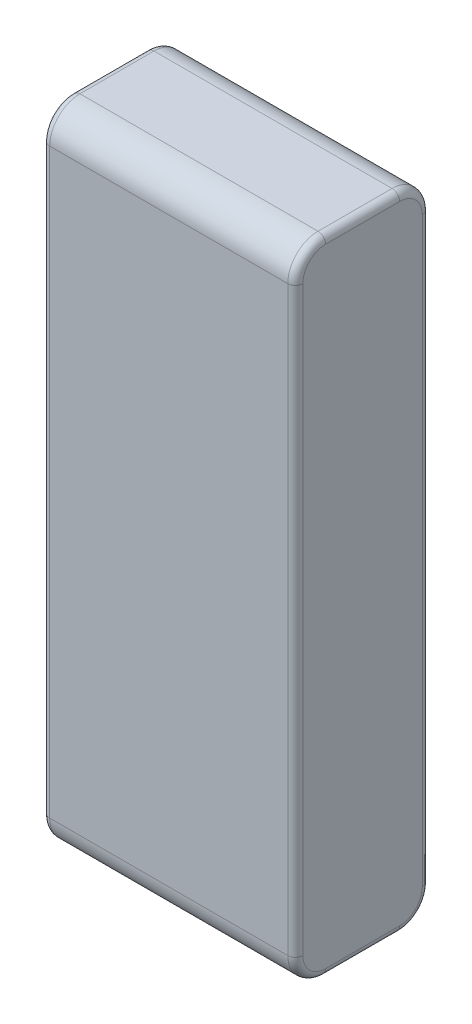
ISO-10303-21;
HEADER;
FILE_DESCRIPTION(('STEP AP214'),'2;1');
FILE_NAME('part.step','',(''),(''),'','','');
FILE_SCHEMA(('AUTOMOTIVE_DESIGN { 1 0 10303 214 1 1 1 1 }'));
ENDSEC;
DATA;
#1=APPLICATION_CONTEXT('core data for automotive mechanical design processes');
#2=APPLICATION_PROTOCOL_DEFINITION('international standard','automotive_design',2000,#1);
#3=PRODUCT_CONTEXT('',#1,'mechanical');
#4=PRODUCT('Part','Part','',(#3));
#5=PRODUCT_RELATED_PRODUCT_CATEGORY('part','',(#4));
#6=PRODUCT_DEFINITION_FORMATION('','',#4);
#7=PRODUCT_DEFINITION_CONTEXT('part definition',#1,'design');
#8=PRODUCT_DEFINITION('design','',#6,#7);
#9=PRODUCT_DEFINITION_SHAPE('','',#8);
#10=(LENGTH_UNIT() NAMED_UNIT(*) SI_UNIT(.MILLI.,.METRE.));
#11=(NAMED_UNIT(*) PLANE_ANGLE_UNIT() SI_UNIT($,.RADIAN.));
#12=(NAMED_UNIT(*) SI_UNIT($,.STERADIAN.) SOLID_ANGLE_UNIT());
#13=UNCERTAINTY_MEASURE_WITH_UNIT(LENGTH_MEASURE(1.E-05),#10,'distance_accuracy_value','');
#14=(GEOMETRIC_REPRESENTATION_CONTEXT(3) GLOBAL_UNCERTAINTY_ASSIGNED_CONTEXT((#13)) GLOBAL_UNIT_ASSIGNED_CONTEXT((#10,
#11,#12)) REPRESENTATION_CONTEXT('',''));
#15=CARTESIAN_POINT('',(0.,0.,0.));
#16=DIRECTION('',(0.,0.,1.));
#17=DIRECTION('',(1.,0.,0.));
#18=AXIS2_PLACEMENT_3D('',#15,#16,#17);
#19=CARTESIAN_POINT('',(16.75,-42.5,8.9));
#20=DIRECTION('',(-1.,0.,0.));
#21=DIRECTION('',(0.,0.,1.));
#22=AXIS2_PLACEMENT_3D('',#19,#20,#21);
#23=PLANE('',#22);
#24=DIRECTION('',(0.,1.,0.));
#25=VECTOR('',#24,1.);
#26=CARTESIAN_POINT('',(16.75,-42.5,7.9));
#27=LINE('',#26,#25);
#28=CARTESIAN_POINT('',(16.75,38.5,7.9));
#29=VERTEX_POINT('',#28);
#30=CARTESIAN_POINT('',(16.75,-38.5,7.9));
#31=VERTEX_POINT('',#30);
#32=EDGE_CURVE('E58',#29,#31,#27,.F.);
#33=ORIENTED_EDGE('',*,*,#32,.T.);
#34=CARTESIAN_POINT('',(16.75,-38.5,4.9));
#35=DIRECTION('',(-1.,0.,0.));
#36=DIRECTION('',(0.,0.,1.));
#37=AXIS2_PLACEMENT_3D('',#34,#35,#36);
#38=CIRCLE('',#37,3.);
#39=CARTESIAN_POINT('',(16.75,-41.5,4.9));
#40=VERTEX_POINT('',#39);
#41=EDGE_CURVE('E275',#31,#40,#38,.F.);
#42=ORIENTED_EDGE('',*,*,#41,.T.);
#43=DIRECTION('',(0.,0.,-1.));
#44=VECTOR('',#43,1.);
#45=CARTESIAN_POINT('',(16.75,-41.5,8.9));
#46=LINE('',#45,#44);
#47=CARTESIAN_POINT('',(16.75,-41.5,-4.9));
#48=VERTEX_POINT('',#47);
#49=EDGE_CURVE('E260',#40,#48,#46,.T.);
#50=ORIENTED_EDGE('',*,*,#49,.T.);
#51=CARTESIAN_POINT('',(16.75,-38.5,-4.9));
#52=DIRECTION('',(-1.,0.,0.));
#53=DIRECTION('',(0.,0.,1.));
#54=AXIS2_PLACEMENT_3D('',#51,#52,#53);
#55=CIRCLE('',#54,3.);
#56=CARTESIAN_POINT('',(16.75,-38.5,-7.9));
#57=VERTEX_POINT('',#56);
#58=EDGE_CURVE('E262',#48,#57,#55,.F.);
#59=ORIENTED_EDGE('',*,*,#58,.T.);
#60=DIRECTION('',(0.,1.,0.));
#61=VECTOR('',#60,1.);
#62=CARTESIAN_POINT('',(16.75,38.5,-7.9));
#63=LINE('',#62,#61);
#64=CARTESIAN_POINT('',(16.75,38.5,-7.9));
#65=VERTEX_POINT('',#64);
#66=EDGE_CURVE('E265',#57,#65,#63,.T.);
#67=ORIENTED_EDGE('',*,*,#66,.T.);
#68=CARTESIAN_POINT('',(16.75,38.5,-4.9));
#69=DIRECTION('',(-1.,0.,0.));
#70=DIRECTION('',(0.,0.,1.));
#71=AXIS2_PLACEMENT_3D('',#68,#69,#70);
#72=CIRCLE('',#71,3.);
#73=CARTESIAN_POINT('',(16.75,41.5,-4.9));
#74=VERTEX_POINT('',#73);
#75=EDGE_CURVE('E268',#65,#74,#72,.F.);
#76=ORIENTED_EDGE('',*,*,#75,.T.);
#77=DIRECTION('',(0.,0.,-1.));
#78=VECTOR('',#77,1.);
#79=CARTESIAN_POINT('',(16.75,41.5,8.9));
#80=LINE('',#79,#78);
#81=CARTESIAN_POINT('',(16.75,41.5,4.9));
#82=VERTEX_POINT('',#81);
#83=EDGE_CURVE('E270',#74,#82,#80,.F.);
#84=ORIENTED_EDGE('',*,*,#83,.T.);
#85=CARTESIAN_POINT('',(16.75,38.5,4.9));
#86=DIRECTION('',(-1.,0.,0.));
#87=DIRECTION('',(0.,0.,1.));
#88=AXIS2_PLACEMENT_3D('',#85,#86,#87);
#89=CIRCLE('',#88,3.);
#90=EDGE_CURVE('E63',#82,#29,#89,.F.);
#91=ORIENTED_EDGE('',*,*,#90,.T.);
#92=EDGE_LOOP('',(#33,#42,#50,#59,#67,#76,#84,#91));
#93=FACE_BOUND('',#92,.T.);
#94=ADVANCED_FACE('F40',(#93),#23,.F.);
#95=CARTESIAN_POINT('',(-16.75,42.5,8.9));
#96=DIRECTION('',(0.,-1.,0.));
#97=DIRECTION('',(0.,0.,-1.));
#98=AXIS2_PLACEMENT_3D('',#95,#96,#97);
#99=PLANE('',#98);
#100=DIRECTION('',(-1.,0.,0.));
#101=VECTOR('',#100,1.);
#102=CARTESIAN_POINT('',(-16.75,42.5,-4.9));
#103=LINE('',#102,#101);
#104=CARTESIAN_POINT('',(15.75,42.5,-4.9));
#105=VERTEX_POINT('',#104);
#106=CARTESIAN_POINT('',(-15.75,42.5,-4.9));
#107=VERTEX_POINT('',#106);
#108=EDGE_CURVE('E196',#105,#107,#103,.T.);
#109=ORIENTED_EDGE('',*,*,#108,.T.);
#110=DIRECTION('',(0.,0.,-1.));
#111=VECTOR('',#110,1.);
#112=CARTESIAN_POINT('',(-15.75,42.5,8.9));
#113=LINE('',#112,#111);
#114=CARTESIAN_POINT('',(-15.75,42.5,4.9));
#115=VERTEX_POINT('',#114);
#116=EDGE_CURVE('E231',#107,#115,#113,.F.);
#117=ORIENTED_EDGE('',*,*,#116,.T.);
#118=DIRECTION('',(-1.,0.,0.));
#119=VECTOR('',#118,1.);
#120=CARTESIAN_POINT('',(-16.75,42.5,4.9));
#121=LINE('',#120,#119);
#122=CARTESIAN_POINT('',(15.75,42.5,4.9));
#123=VERTEX_POINT('',#122);
#124=EDGE_CURVE('E202',#115,#123,#121,.F.);
#125=ORIENTED_EDGE('',*,*,#124,.T.);
#126=DIRECTION('',(0.,0.,-1.));
#127=VECTOR('',#126,1.);
#128=CARTESIAN_POINT('',(15.75,42.5,8.9));
#129=LINE('',#128,#127);
#130=EDGE_CURVE('E229',#123,#105,#129,.T.);
#131=ORIENTED_EDGE('',*,*,#130,.T.);
#132=EDGE_LOOP('',(#109,#117,#125,#131));
#133=FACE_BOUND('',#132,.T.);
#134=ADVANCED_FACE('F366',(#133),#99,.F.);
#135=CARTESIAN_POINT('',(-16.75,-42.5,8.9));
#136=DIRECTION('',(1.,0.,0.));
#137=DIRECTION('',(0.,0.,-1.));
#138=AXIS2_PLACEMENT_3D('',#135,#136,#137);
#139=PLANE('',#138);
#140=DIRECTION('',(0.,-1.,0.));
#141=VECTOR('',#140,1.);
#142=CARTESIAN_POINT('',(-16.75,-42.5,7.9));
#143=LINE('',#142,#141);
#144=CARTESIAN_POINT('',(-16.75,-38.5,7.9));
#145=VERTEX_POINT('',#144);
#146=CARTESIAN_POINT('',(-16.75,38.5,7.9));
#147=VERTEX_POINT('',#146);
#148=EDGE_CURVE('E172',#145,#147,#143,.F.);
#149=ORIENTED_EDGE('',*,*,#148,.T.);
#150=CARTESIAN_POINT('',(-16.75,38.5,4.9));
#151=DIRECTION('',(1.,0.,0.));
#152=DIRECTION('',(0.,0.,-1.));
#153=AXIS2_PLACEMENT_3D('',#150,#151,#152);
#154=CIRCLE('',#153,3.);
#155=CARTESIAN_POINT('',(-16.75,41.5,4.9));
#156=VERTEX_POINT('',#155);
#157=EDGE_CURVE('E219',#147,#156,#154,.F.);
#158=ORIENTED_EDGE('',*,*,#157,.T.);
#159=DIRECTION('',(0.,0.,-1.));
#160=VECTOR('',#159,1.);
#161=CARTESIAN_POINT('',(-16.75,41.5,8.9));
#162=LINE('',#161,#160);
#163=CARTESIAN_POINT('',(-16.75,41.5,-4.9));
#164=VERTEX_POINT('',#163);
#165=EDGE_CURVE('E216',#156,#164,#162,.T.);
#166=ORIENTED_EDGE('',*,*,#165,.T.);
#167=CARTESIAN_POINT('',(-16.75,38.5,-4.9));
#168=DIRECTION('',(1.,0.,0.));
#169=DIRECTION('',(0.,0.,-1.));
#170=AXIS2_PLACEMENT_3D('',#167,#168,#169);
#171=CIRCLE('',#170,3.);
#172=CARTESIAN_POINT('',(-16.75,38.5,-7.9));
#173=VERTEX_POINT('',#172);
#174=EDGE_CURVE('E214',#164,#173,#171,.F.);
#175=ORIENTED_EDGE('',*,*,#174,.T.);
#176=DIRECTION('',(0.,-1.,0.));
#177=VECTOR('',#176,1.);
#178=CARTESIAN_POINT('',(-16.75,-38.5,-7.9));
#179=LINE('',#178,#177);
#180=CARTESIAN_POINT('',(-16.75,-38.5,-7.9));
#181=VERTEX_POINT('',#180);
#182=EDGE_CURVE('E211',#173,#181,#179,.T.);
#183=ORIENTED_EDGE('',*,*,#182,.T.);
#184=CARTESIAN_POINT('',(-16.75,-38.5,-4.9));
#185=DIRECTION('',(1.,0.,0.));
#186=DIRECTION('',(0.,0.,-1.));
#187=AXIS2_PLACEMENT_3D('',#184,#185,#186);
#188=CIRCLE('',#187,3.);
#189=CARTESIAN_POINT('',(-16.75,-41.5,-4.9));
#190=VERTEX_POINT('',#189);
#191=EDGE_CURVE('E208',#181,#190,#188,.F.);
#192=ORIENTED_EDGE('',*,*,#191,.T.);
#193=DIRECTION('',(0.,0.,-1.));
#194=VECTOR('',#193,1.);
#195=CARTESIAN_POINT('',(-16.75,-41.5,8.9));
#196=LINE('',#195,#194);
#197=CARTESIAN_POINT('',(-16.75,-41.5,4.9));
#198=VERTEX_POINT('',#197);
#199=EDGE_CURVE('E175',#190,#198,#196,.F.);
#200=ORIENTED_EDGE('',*,*,#199,.T.);
#201=CARTESIAN_POINT('',(-16.75,-38.5,4.9));
#202=DIRECTION('',(1.,0.,0.));
#203=DIRECTION('',(0.,0.,-1.));
#204=AXIS2_PLACEMENT_3D('',#201,#202,#203);
#205=CIRCLE('',#204,3.);
#206=EDGE_CURVE('E167',#198,#145,#205,.F.);
#207=ORIENTED_EDGE('',*,*,#206,.T.);
#208=EDGE_LOOP('',(#149,#158,#166,#175,#183,#192,#200,#207));
#209=FACE_BOUND('',#208,.T.);
#210=ADVANCED_FACE('F169',(#209),#139,.F.);
#211=CARTESIAN_POINT('',(-16.75,-42.5,8.9));
#212=DIRECTION('',(0.,1.,0.));
#213=DIRECTION('',(0.,0.,1.));
#214=AXIS2_PLACEMENT_3D('',#211,#212,#213);
#215=PLANE('',#214);
#216=DIRECTION('',(1.,0.,0.));
#217=VECTOR('',#216,1.);
#218=CARTESIAN_POINT('',(-16.75,-42.5,4.9));
#219=LINE('',#218,#217);
#220=CARTESIAN_POINT('',(15.75,-42.5,4.9));
#221=VERTEX_POINT('',#220);
#222=CARTESIAN_POINT('',(-15.75,-42.5,4.9));
#223=VERTEX_POINT('',#222);
#224=EDGE_CURVE('E298',#221,#223,#219,.F.);
#225=ORIENTED_EDGE('',*,*,#224,.T.);
#226=DIRECTION('',(0.,0.,-1.));
#227=VECTOR('',#226,1.);
#228=CARTESIAN_POINT('',(-15.75,-42.5,8.9));
#229=LINE('',#228,#227);
#230=CARTESIAN_POINT('',(-15.75,-42.5,-4.9));
#231=VERTEX_POINT('',#230);
#232=EDGE_CURVE('E252',#223,#231,#229,.T.);
#233=ORIENTED_EDGE('',*,*,#232,.T.);
#234=DIRECTION('',(1.,0.,0.));
#235=VECTOR('',#234,1.);
#236=CARTESIAN_POINT('',(16.75,-42.5,-4.9));
#237=LINE('',#236,#235);
#238=CARTESIAN_POINT('',(15.75,-42.5,-4.9));
#239=VERTEX_POINT('',#238);
#240=EDGE_CURVE('E346',#231,#239,#237,.T.);
#241=ORIENTED_EDGE('',*,*,#240,.T.);
#242=DIRECTION('',(0.,0.,-1.));
#243=VECTOR('',#242,1.);
#244=CARTESIAN_POINT('',(15.75,-42.5,8.9));
#245=LINE('',#244,#243);
#246=EDGE_CURVE('E250',#239,#221,#245,.F.);
#247=ORIENTED_EDGE('',*,*,#246,.T.);
#248=EDGE_LOOP('',(#225,#233,#241,#247));
#249=FACE_BOUND('',#248,.T.);
#250=ADVANCED_FACE('F399',(#249),#215,.F.);
#251=CARTESIAN_POINT('',(0.,0.,8.9));
#252=DIRECTION('',(0.,0.,-1.));
#253=DIRECTION('',(-1.,0.,0.));
#254=AXIS2_PLACEMENT_3D('',#251,#252,#253);
#255=PLANE('',#254);
#256=DIRECTION('',(1.,0.,0.));
#257=VECTOR('',#256,1.);
#258=CARTESIAN_POINT('',(0.,-38.5,8.9));
#259=LINE('',#258,#257);
#260=CARTESIAN_POINT('',(-15.75,-38.5,8.9));
#261=VERTEX_POINT('',#260);
#262=CARTESIAN_POINT('',(15.75,-38.5,8.9));
#263=VERTEX_POINT('',#262);
#264=EDGE_CURVE('E359',#261,#263,#259,.T.);
#265=ORIENTED_EDGE('',*,*,#264,.T.);
#266=DIRECTION('',(0.,1.,0.));
#267=VECTOR('',#266,1.);
#268=CARTESIAN_POINT('',(15.75,0.,8.9));
#269=LINE('',#268,#267);
#270=CARTESIAN_POINT('',(15.75,38.5,8.9));
#271=VERTEX_POINT('',#270);
#272=EDGE_CURVE('E11',#263,#271,#269,.T.);
#273=ORIENTED_EDGE('',*,*,#272,.T.);
#274=DIRECTION('',(-1.,0.,0.));
#275=VECTOR('',#274,1.);
#276=CARTESIAN_POINT('',(0.,38.5,8.9));
#277=LINE('',#276,#275);
#278=CARTESIAN_POINT('',(-15.75,38.5,8.9));
#279=VERTEX_POINT('',#278);
#280=EDGE_CURVE('E349',#271,#279,#277,.T.);
#281=ORIENTED_EDGE('',*,*,#280,.T.);
#282=DIRECTION('',(0.,-1.,0.));
#283=VECTOR('',#282,1.);
#284=CARTESIAN_POINT('',(-15.75,0.,8.9));
#285=LINE('',#284,#283);
#286=EDGE_CURVE('E50',#279,#261,#285,.T.);
#287=ORIENTED_EDGE('',*,*,#286,.T.);
#288=EDGE_LOOP('',(#265,#273,#281,#287));
#289=FACE_BOUND('',#288,.T.);
#290=ADVANCED_FACE('F426',(#289),#255,.F.);
#291=CARTESIAN_POINT('',(0.,0.,-8.9));
#292=DIRECTION('',(0.,0.,-1.));
#293=DIRECTION('',(-1.,0.,0.));
#294=AXIS2_PLACEMENT_3D('',#291,#292,#293);
#295=PLANE('',#294);
#296=DIRECTION('',(1.,0.,0.));
#297=VECTOR('',#296,1.);
#298=CARTESIAN_POINT('',(-16.75,-38.5,-8.9));
#299=LINE('',#298,#297);
#300=CARTESIAN_POINT('',(15.75,-38.5,-8.9));
#301=VERTEX_POINT('',#300);
#302=CARTESIAN_POINT('',(-15.75,-38.5,-8.9));
#303=VERTEX_POINT('',#302);
#304=EDGE_CURVE('E345',#301,#303,#299,.F.);
#305=ORIENTED_EDGE('',*,*,#304,.T.);
#306=DIRECTION('',(0.,-1.,0.));
#307=VECTOR('',#306,1.);
#308=CARTESIAN_POINT('',(-15.75,38.5,-8.9));
#309=LINE('',#308,#307);
#310=CARTESIAN_POINT('',(-15.75,38.5,-8.9));
#311=VERTEX_POINT('',#310);
#312=EDGE_CURVE('E242',#303,#311,#309,.F.);
#313=ORIENTED_EDGE('',*,*,#312,.T.);
#314=DIRECTION('',(-1.,0.,0.));
#315=VECTOR('',#314,1.);
#316=CARTESIAN_POINT('',(16.75,38.5,-8.9));
#317=LINE('',#316,#315);
#318=CARTESIAN_POINT('',(15.75,38.5,-8.9));
#319=VERTEX_POINT('',#318);
#320=EDGE_CURVE('E337',#311,#319,#317,.F.);
#321=ORIENTED_EDGE('',*,*,#320,.T.);
#322=DIRECTION('',(0.,1.,0.));
#323=VECTOR('',#322,1.);
#324=CARTESIAN_POINT('',(15.75,-38.5,-8.9));
#325=LINE('',#324,#323);
#326=EDGE_CURVE('E239',#319,#301,#325,.F.);
#327=ORIENTED_EDGE('',*,*,#326,.T.);
#328=EDGE_LOOP('',(#305,#313,#321,#327));
#329=FACE_BOUND('',#328,.T.);
#330=ADVANCED_FACE('F341',(#329),#295,.T.);
#331=CARTESIAN_POINT('',(-16.75,-38.5,-4.9));
#332=DIRECTION('',(-1.,0.,0.));
#333=DIRECTION('',(0.,0.,1.));
#334=AXIS2_PLACEMENT_3D('',#331,#332,#333);
#335=CYLINDRICAL_SURFACE('',#334,4.);
#336=ORIENTED_EDGE('',*,*,#240,.F.);
#337=CARTESIAN_POINT('',(-15.75,-38.5,-4.9));
#338=DIRECTION('',(1.,0.,0.));
#339=DIRECTION('',(0.,0.,-1.));
#340=AXIS2_PLACEMENT_3D('',#337,#338,#339);
#341=CIRCLE('',#340,4.);
#342=EDGE_CURVE('E248',#231,#303,#341,.T.);
#343=ORIENTED_EDGE('',*,*,#342,.T.);
#344=ORIENTED_EDGE('',*,*,#304,.F.);
#345=CARTESIAN_POINT('',(15.75,-38.5,-4.9));
#346=DIRECTION('',(-1.,0.,0.));
#347=DIRECTION('',(0.,0.,1.));
#348=AXIS2_PLACEMENT_3D('',#345,#346,#347);
#349=CIRCLE('',#348,4.);
#350=EDGE_CURVE('E245',#301,#239,#349,.T.);
#351=ORIENTED_EDGE('',*,*,#350,.T.);
#352=EDGE_LOOP('',(#336,#343,#344,#351));
#353=FACE_BOUND('',#352,.T.);
#354=ADVANCED_FACE('F403',(#353),#335,.T.);
#355=CARTESIAN_POINT('',(0.,-38.5,4.9));
#356=DIRECTION('',(1.,0.,0.));
#357=DIRECTION('',(0.,0.,-1.));
#358=AXIS2_PLACEMENT_3D('',#355,#356,#357);
#359=CYLINDRICAL_SURFACE('',#358,4.);
#360=ORIENTED_EDGE('',*,*,#264,.F.);
#361=CARTESIAN_POINT('',(-15.75,-38.5,4.9));
#362=DIRECTION('',(1.,0.,0.));
#363=DIRECTION('',(0.,0.,-1.));
#364=AXIS2_PLACEMENT_3D('',#361,#362,#363);
#365=CIRCLE('',#364,4.);
#366=EDGE_CURVE('E185',#261,#223,#365,.T.);
#367=ORIENTED_EDGE('',*,*,#366,.T.);
#368=ORIENTED_EDGE('',*,*,#224,.F.);
#369=CARTESIAN_POINT('',(15.75,-38.5,4.9));
#370=DIRECTION('',(-1.,0.,0.));
#371=DIRECTION('',(0.,0.,1.));
#372=AXIS2_PLACEMENT_3D('',#369,#370,#371);
#373=CIRCLE('',#372,4.);
#374=EDGE_CURVE('E255',#221,#263,#373,.T.);
#375=ORIENTED_EDGE('',*,*,#374,.T.);
#376=EDGE_LOOP('',(#360,#367,#368,#375));
#377=FACE_BOUND('',#376,.T.);
#378=ADVANCED_FACE('F417',(#377),#359,.T.);
#379=CARTESIAN_POINT('',(-16.75,38.5,-4.9));
#380=DIRECTION('',(1.,0.,0.));
#381=DIRECTION('',(0.,0.,-1.));
#382=AXIS2_PLACEMENT_3D('',#379,#380,#381);
#383=CYLINDRICAL_SURFACE('',#382,4.);
#384=ORIENTED_EDGE('',*,*,#320,.F.);
#385=CARTESIAN_POINT('',(-15.75,38.5,-4.9));
#386=DIRECTION('',(1.,0.,0.));
#387=DIRECTION('',(0.,0.,-1.));
#388=AXIS2_PLACEMENT_3D('',#385,#386,#387);
#389=CIRCLE('',#388,4.);
#390=EDGE_CURVE('E236',#311,#107,#389,.T.);
#391=ORIENTED_EDGE('',*,*,#390,.T.);
#392=ORIENTED_EDGE('',*,*,#108,.F.);
#393=CARTESIAN_POINT('',(15.75,38.5,-4.9));
#394=DIRECTION('',(-1.,0.,0.));
#395=DIRECTION('',(0.,0.,1.));
#396=AXIS2_PLACEMENT_3D('',#393,#394,#395);
#397=CIRCLE('',#396,4.);
#398=EDGE_CURVE('E234',#105,#319,#397,.T.);
#399=ORIENTED_EDGE('',*,*,#398,.T.);
#400=EDGE_LOOP('',(#384,#391,#392,#399));
#401=FACE_BOUND('',#400,.T.);
#402=ADVANCED_FACE('F336',(#401),#383,.T.);
#403=CARTESIAN_POINT('',(0.,38.5,4.9));
#404=DIRECTION('',(-1.,0.,0.));
#405=DIRECTION('',(0.,0.,1.));
#406=AXIS2_PLACEMENT_3D('',#403,#404,#405);
#407=CYLINDRICAL_SURFACE('',#406,4.);
#408=ORIENTED_EDGE('',*,*,#124,.F.);
#409=CARTESIAN_POINT('',(-15.75,38.5,4.9));
#410=DIRECTION('',(1.,0.,0.));
#411=DIRECTION('',(0.,0.,-1.));
#412=AXIS2_PLACEMENT_3D('',#409,#410,#411);
#413=CIRCLE('',#412,4.);
#414=EDGE_CURVE('E225',#115,#279,#413,.T.);
#415=ORIENTED_EDGE('',*,*,#414,.T.);
#416=ORIENTED_EDGE('',*,*,#280,.F.);
#417=CARTESIAN_POINT('',(15.75,38.5,4.9));
#418=DIRECTION('',(-1.,0.,0.));
#419=DIRECTION('',(0.,0.,1.));
#420=AXIS2_PLACEMENT_3D('',#417,#418,#419);
#421=CIRCLE('',#420,4.);
#422=EDGE_CURVE('E222',#271,#123,#421,.T.);
#423=ORIENTED_EDGE('',*,*,#422,.T.);
#424=EDGE_LOOP('',(#408,#415,#416,#423));
#425=FACE_BOUND('',#424,.T.);
#426=ADVANCED_FACE('F370',(#425),#407,.T.);
#427=CARTESIAN_POINT('',(-15.75,-38.5,-4.9));
#428=DIRECTION('',(1.,0.,0.));
#429=DIRECTION('',(0.,0.,-1.));
#430=AXIS2_PLACEMENT_3D('',#427,#428,#429);
#431=TOROIDAL_SURFACE('',#430,3.,1.);
#432=CARTESIAN_POINT('',(-15.75,-38.5,-7.9));
#433=DIRECTION('',(0.,1.,0.));
#434=DIRECTION('',(0.,0.,1.));
#435=AXIS2_PLACEMENT_3D('',#432,#433,#434);
#436=CIRCLE('',#435,1.);
#437=EDGE_CURVE('E291',#303,#181,#436,.T.);
#438=ORIENTED_EDGE('',*,*,#437,.F.);
#439=ORIENTED_EDGE('',*,*,#342,.F.);
#440=CARTESIAN_POINT('',(-15.75,-41.5,-4.9));
#441=DIRECTION('',(0.,0.,1.));
#442=DIRECTION('',(1.,0.,0.));
#443=AXIS2_PLACEMENT_3D('',#440,#441,#442);
#444=CIRCLE('',#443,1.);
#445=EDGE_CURVE('E294',#190,#231,#444,.T.);
#446=ORIENTED_EDGE('',*,*,#445,.F.);
#447=ORIENTED_EDGE('',*,*,#191,.F.);
#448=EDGE_LOOP('',(#438,#439,#446,#447));
#449=FACE_BOUND('',#448,.T.);
#450=ADVANCED_FACE('F391',(#449),#431,.T.);
#451=CARTESIAN_POINT('',(-15.75,-41.5,8.9));
#452=DIRECTION('',(0.,0.,-1.));
#453=DIRECTION('',(-1.,0.,0.));
#454=AXIS2_PLACEMENT_3D('',#451,#452,#453);
#455=CYLINDRICAL_SURFACE('',#454,1.);
#456=ORIENTED_EDGE('',*,*,#445,.T.);
#457=ORIENTED_EDGE('',*,*,#232,.F.);
#458=CARTESIAN_POINT('',(-15.75,-41.5,4.9));
#459=DIRECTION('',(0.,0.,1.));
#460=DIRECTION('',(1.,0.,0.));
#461=AXIS2_PLACEMENT_3D('',#458,#459,#460);
#462=CIRCLE('',#461,1.);
#463=EDGE_CURVE('E288',#198,#223,#462,.T.);
#464=ORIENTED_EDGE('',*,*,#463,.F.);
#465=ORIENTED_EDGE('',*,*,#199,.F.);
#466=EDGE_LOOP('',(#456,#457,#464,#465));
#467=FACE_BOUND('',#466,.T.);
#468=ADVANCED_FACE('F395',(#467),#455,.T.);
#469=CARTESIAN_POINT('',(-15.75,-42.5,-7.9));
#470=DIRECTION('',(0.,1.,0.));
#471=DIRECTION('',(0.,0.,1.));
#472=AXIS2_PLACEMENT_3D('',#469,#470,#471);
#473=CYLINDRICAL_SURFACE('',#472,1.);
#474=ORIENTED_EDGE('',*,*,#437,.T.);
#475=ORIENTED_EDGE('',*,*,#182,.F.);
#476=CARTESIAN_POINT('',(-15.75,38.5,-7.9));
#477=DIRECTION('',(0.,1.,0.));
#478=DIRECTION('',(0.,0.,1.));
#479=AXIS2_PLACEMENT_3D('',#476,#477,#478);
#480=CIRCLE('',#479,1.);
#481=EDGE_CURVE('E189',#311,#173,#480,.T.);
#482=ORIENTED_EDGE('',*,*,#481,.F.);
#483=ORIENTED_EDGE('',*,*,#312,.F.);
#484=EDGE_LOOP('',(#474,#475,#482,#483));
#485=FACE_BOUND('',#484,.T.);
#486=ADVANCED_FACE('F386',(#485),#473,.T.);
#487=CARTESIAN_POINT('',(-15.75,-38.5,4.9));
#488=DIRECTION('',(1.,0.,0.));
#489=DIRECTION('',(0.,0.,-1.));
#490=AXIS2_PLACEMENT_3D('',#487,#488,#489);
#491=TOROIDAL_SURFACE('',#490,3.,1.);
#492=ORIENTED_EDGE('',*,*,#463,.T.);
#493=ORIENTED_EDGE('',*,*,#366,.F.);
#494=CARTESIAN_POINT('',(-15.75,-38.5,7.9));
#495=DIRECTION('',(0.,1.,0.));
#496=DIRECTION('',(0.,0.,1.));
#497=AXIS2_PLACEMENT_3D('',#494,#495,#496);
#498=CIRCLE('',#497,1.);
#499=EDGE_CURVE('E183',#145,#261,#498,.T.);
#500=ORIENTED_EDGE('',*,*,#499,.F.);
#501=ORIENTED_EDGE('',*,*,#206,.F.);
#502=EDGE_LOOP('',(#492,#493,#500,#501));
#503=FACE_BOUND('',#502,.T.);
#504=ADVANCED_FACE('F184',(#503),#491,.T.);
#505=CARTESIAN_POINT('',(-15.75,38.5,-4.9));
#506=DIRECTION('',(1.,0.,0.));
#507=DIRECTION('',(0.,0.,-1.));
#508=AXIS2_PLACEMENT_3D('',#505,#506,#507);
#509=TOROIDAL_SURFACE('',#508,3.,1.);
#510=ORIENTED_EDGE('',*,*,#481,.T.);
#511=ORIENTED_EDGE('',*,*,#174,.F.);
#512=CARTESIAN_POINT('',(-15.75,41.5,-4.9));
#513=DIRECTION('',(0.,0.,1.));
#514=DIRECTION('',(1.,0.,0.));
#515=AXIS2_PLACEMENT_3D('',#512,#513,#514);
#516=CIRCLE('',#515,1.);
#517=EDGE_CURVE('E190',#107,#164,#516,.T.);
#518=ORIENTED_EDGE('',*,*,#517,.F.);
#519=ORIENTED_EDGE('',*,*,#390,.F.);
#520=EDGE_LOOP('',(#510,#511,#518,#519));
#521=FACE_BOUND('',#520,.T.);
#522=ADVANCED_FACE('F383',(#521),#509,.T.);
#523=CARTESIAN_POINT('',(-15.75,0.,7.9));
#524=DIRECTION('',(0.,-1.,0.));
#525=DIRECTION('',(0.,0.,-1.));
#526=AXIS2_PLACEMENT_3D('',#523,#524,#525);
#527=CYLINDRICAL_SURFACE('',#526,1.);
#528=ORIENTED_EDGE('',*,*,#499,.T.);
#529=ORIENTED_EDGE('',*,*,#286,.F.);
#530=CARTESIAN_POINT('',(-15.75,38.5,7.9));
#531=DIRECTION('',(0.,1.,0.));
#532=DIRECTION('',(0.,0.,1.));
#533=AXIS2_PLACEMENT_3D('',#530,#531,#532);
#534=CIRCLE('',#533,1.);
#535=EDGE_CURVE('E193',#147,#279,#534,.T.);
#536=ORIENTED_EDGE('',*,*,#535,.F.);
#537=ORIENTED_EDGE('',*,*,#148,.F.);
#538=EDGE_LOOP('',(#528,#529,#536,#537));
#539=FACE_BOUND('',#538,.T.);
#540=ADVANCED_FACE('F192',(#539),#527,.T.);
#541=CARTESIAN_POINT('',(-15.75,41.5,8.9));
#542=DIRECTION('',(0.,0.,-1.));
#543=DIRECTION('',(-1.,0.,0.));
#544=AXIS2_PLACEMENT_3D('',#541,#542,#543);
#545=CYLINDRICAL_SURFACE('',#544,1.);
#546=ORIENTED_EDGE('',*,*,#517,.T.);
#547=ORIENTED_EDGE('',*,*,#165,.F.);
#548=CARTESIAN_POINT('',(-15.75,41.5,4.9));
#549=DIRECTION('',(0.,0.,1.));
#550=DIRECTION('',(1.,0.,0.));
#551=AXIS2_PLACEMENT_3D('',#548,#549,#550);
#552=CIRCLE('',#551,1.);
#553=EDGE_CURVE('E278',#115,#156,#552,.T.);
#554=ORIENTED_EDGE('',*,*,#553,.F.);
#555=ORIENTED_EDGE('',*,*,#116,.F.);
#556=EDGE_LOOP('',(#546,#547,#554,#555));
#557=FACE_BOUND('',#556,.T.);
#558=ADVANCED_FACE('F378',(#557),#545,.T.);
#559=CARTESIAN_POINT('',(-15.75,38.5,4.9));
#560=DIRECTION('',(1.,0.,0.));
#561=DIRECTION('',(0.,0.,-1.));
#562=AXIS2_PLACEMENT_3D('',#559,#560,#561);
#563=TOROIDAL_SURFACE('',#562,3.,1.);
#564=ORIENTED_EDGE('',*,*,#535,.T.);
#565=ORIENTED_EDGE('',*,*,#414,.F.);
#566=ORIENTED_EDGE('',*,*,#553,.T.);
#567=ORIENTED_EDGE('',*,*,#157,.F.);
#568=EDGE_LOOP('',(#564,#565,#566,#567));
#569=FACE_BOUND('',#568,.T.);
#570=ADVANCED_FACE('F375',(#569),#563,.T.);
#571=CARTESIAN_POINT('',(15.75,38.5,-4.9));
#572=DIRECTION('',(-1.,0.,0.));
#573=DIRECTION('',(0.,0.,1.));
#574=AXIS2_PLACEMENT_3D('',#571,#572,#573);
#575=TOROIDAL_SURFACE('',#574,3.,1.);
#576=CARTESIAN_POINT('',(15.75,38.5,-7.9));
#577=DIRECTION('',(0.,-1.,0.));
#578=DIRECTION('',(0.,0.,-1.));
#579=AXIS2_PLACEMENT_3D('',#576,#577,#578);
#580=CIRCLE('',#579,1.);
#581=EDGE_CURVE('E316',#319,#65,#580,.T.);
#582=ORIENTED_EDGE('',*,*,#581,.F.);
#583=ORIENTED_EDGE('',*,*,#398,.F.);
#584=CARTESIAN_POINT('',(15.75,41.5,-4.9));
#585=DIRECTION('',(0.,0.,1.));
#586=DIRECTION('',(1.,0.,0.));
#587=AXIS2_PLACEMENT_3D('',#584,#585,#586);
#588=CIRCLE('',#587,1.);
#589=EDGE_CURVE('E44',#74,#105,#588,.T.);
#590=ORIENTED_EDGE('',*,*,#589,.F.);
#591=ORIENTED_EDGE('',*,*,#75,.F.);
#592=EDGE_LOOP('',(#582,#583,#590,#591));
#593=FACE_BOUND('',#592,.T.);
#594=ADVANCED_FACE('F42',(#593),#575,.T.);
#595=CARTESIAN_POINT('',(15.75,41.5,8.9));
#596=DIRECTION('',(0.,0.,-1.));
#597=DIRECTION('',(-1.,0.,0.));
#598=AXIS2_PLACEMENT_3D('',#595,#596,#597);
#599=CYLINDRICAL_SURFACE('',#598,1.);
#600=ORIENTED_EDGE('',*,*,#589,.T.);
#601=ORIENTED_EDGE('',*,*,#130,.F.);
#602=CARTESIAN_POINT('',(15.75,41.5,4.9));
#603=DIRECTION('',(0.,0.,1.));
#604=DIRECTION('',(1.,0.,0.));
#605=AXIS2_PLACEMENT_3D('',#602,#603,#604);
#606=CIRCLE('',#605,1.);
#607=EDGE_CURVE('E314',#82,#123,#606,.T.);
#608=ORIENTED_EDGE('',*,*,#607,.F.);
#609=ORIENTED_EDGE('',*,*,#83,.F.);
#610=EDGE_LOOP('',(#600,#601,#608,#609));
#611=FACE_BOUND('',#610,.T.);
#612=ADVANCED_FACE('F327',(#611),#599,.T.);
#613=CARTESIAN_POINT('',(15.75,-42.5,-7.9));
#614=DIRECTION('',(0.,-1.,0.));
#615=DIRECTION('',(0.,0.,-1.));
#616=AXIS2_PLACEMENT_3D('',#613,#614,#615);
#617=CYLINDRICAL_SURFACE('',#616,1.);
#618=ORIENTED_EDGE('',*,*,#581,.T.);
#619=ORIENTED_EDGE('',*,*,#66,.F.);
#620=CARTESIAN_POINT('',(15.75,-38.5,-7.9));
#621=DIRECTION('',(0.,-1.,0.));
#622=DIRECTION('',(0.,0.,-1.));
#623=AXIS2_PLACEMENT_3D('',#620,#621,#622);
#624=CIRCLE('',#623,1.);
#625=EDGE_CURVE('E310',#301,#57,#624,.T.);
#626=ORIENTED_EDGE('',*,*,#625,.F.);
#627=ORIENTED_EDGE('',*,*,#326,.F.);
#628=EDGE_LOOP('',(#618,#619,#626,#627));
#629=FACE_BOUND('',#628,.T.);
#630=ADVANCED_FACE('F430',(#629),#617,.T.);
#631=CARTESIAN_POINT('',(15.75,38.5,4.9));
#632=DIRECTION('',(-1.,0.,0.));
#633=DIRECTION('',(0.,0.,1.));
#634=AXIS2_PLACEMENT_3D('',#631,#632,#633);
#635=TOROIDAL_SURFACE('',#634,3.,1.);
#636=ORIENTED_EDGE('',*,*,#607,.T.);
#637=ORIENTED_EDGE('',*,*,#422,.F.);
#638=CARTESIAN_POINT('',(15.75,38.5,7.9));
#639=DIRECTION('',(0.,-1.,0.));
#640=DIRECTION('',(0.,0.,-1.));
#641=AXIS2_PLACEMENT_3D('',#638,#639,#640);
#642=CIRCLE('',#641,1.);
#643=EDGE_CURVE('E306',#29,#271,#642,.T.);
#644=ORIENTED_EDGE('',*,*,#643,.F.);
#645=ORIENTED_EDGE('',*,*,#90,.F.);
#646=EDGE_LOOP('',(#636,#637,#644,#645));
#647=FACE_BOUND('',#646,.T.);
#648=ADVANCED_FACE('F428',(#647),#635,.T.);
#649=CARTESIAN_POINT('',(15.75,-38.5,-4.9));
#650=DIRECTION('',(-1.,0.,0.));
#651=DIRECTION('',(0.,0.,1.));
#652=AXIS2_PLACEMENT_3D('',#649,#650,#651);
#653=TOROIDAL_SURFACE('',#652,3.,1.);
#654=ORIENTED_EDGE('',*,*,#625,.T.);
#655=ORIENTED_EDGE('',*,*,#58,.F.);
#656=CARTESIAN_POINT('',(15.75,-41.5,-4.9));
#657=DIRECTION('',(0.,0.,1.));
#658=DIRECTION('',(1.,0.,0.));
#659=AXIS2_PLACEMENT_3D('',#656,#657,#658);
#660=CIRCLE('',#659,1.);
#661=EDGE_CURVE('E303',#239,#48,#660,.T.);
#662=ORIENTED_EDGE('',*,*,#661,.F.);
#663=ORIENTED_EDGE('',*,*,#350,.F.);
#664=EDGE_LOOP('',(#654,#655,#662,#663));
#665=FACE_BOUND('',#664,.T.);
#666=ADVANCED_FACE('F407',(#665),#653,.T.);
#667=CARTESIAN_POINT('',(15.75,0.,7.9));
#668=DIRECTION('',(0.,1.,0.));
#669=DIRECTION('',(0.,0.,1.));
#670=AXIS2_PLACEMENT_3D('',#667,#668,#669);
#671=CYLINDRICAL_SURFACE('',#670,1.);
#672=ORIENTED_EDGE('',*,*,#643,.T.);
#673=ORIENTED_EDGE('',*,*,#272,.F.);
#674=CARTESIAN_POINT('',(15.75,-38.5,7.9));
#675=DIRECTION('',(0.,-1.,0.));
#676=DIRECTION('',(0.,0.,-1.));
#677=AXIS2_PLACEMENT_3D('',#674,#675,#676);
#678=CIRCLE('',#677,1.);
#679=EDGE_CURVE('E301',#31,#263,#678,.T.);
#680=ORIENTED_EDGE('',*,*,#679,.F.);
#681=ORIENTED_EDGE('',*,*,#32,.F.);
#682=EDGE_LOOP('',(#672,#673,#680,#681));
#683=FACE_BOUND('',#682,.T.);
#684=ADVANCED_FACE('F424',(#683),#671,.T.);
#685=CARTESIAN_POINT('',(15.75,-41.5,8.9));
#686=DIRECTION('',(0.,0.,-1.));
#687=DIRECTION('',(-1.,0.,0.));
#688=AXIS2_PLACEMENT_3D('',#685,#686,#687);
#689=CYLINDRICAL_SURFACE('',#688,1.);
#690=ORIENTED_EDGE('',*,*,#661,.T.);
#691=ORIENTED_EDGE('',*,*,#49,.F.);
#692=CARTESIAN_POINT('',(15.75,-41.5,4.9));
#693=DIRECTION('',(0.,0.,1.));
#694=DIRECTION('',(1.,0.,0.));
#695=AXIS2_PLACEMENT_3D('',#692,#693,#694);
#696=CIRCLE('',#695,1.);
#697=EDGE_CURVE('E299',#221,#40,#696,.T.);
#698=ORIENTED_EDGE('',*,*,#697,.F.);
#699=ORIENTED_EDGE('',*,*,#246,.F.);
#700=EDGE_LOOP('',(#690,#691,#698,#699));
#701=FACE_BOUND('',#700,.T.);
#702=ADVANCED_FACE('F413',(#701),#689,.T.);
#703=CARTESIAN_POINT('',(15.75,-38.5,4.9));
#704=DIRECTION('',(-1.,0.,0.));
#705=DIRECTION('',(0.,0.,1.));
#706=AXIS2_PLACEMENT_3D('',#703,#704,#705);
#707=TOROIDAL_SURFACE('',#706,3.,1.);
#708=ORIENTED_EDGE('',*,*,#679,.T.);
#709=ORIENTED_EDGE('',*,*,#374,.F.);
#710=ORIENTED_EDGE('',*,*,#697,.T.);
#711=ORIENTED_EDGE('',*,*,#41,.F.);
#712=EDGE_LOOP('',(#708,#709,#710,#711));
#713=FACE_BOUND('',#712,.T.);
#714=ADVANCED_FACE('F420',(#713),#707,.T.);
#715=CLOSED_SHELL('',(#94,#134,#210,#250,#290,#330,#354,#378,#402,#426,#450,#468,#486,#504,#522,
#540,#558,#570,#594,#612,#630,#648,#666,#684,#702,#714));
#716=MANIFOLD_SOLID_BREP('B2',#715);
#717=ADVANCED_BREP_SHAPE_REPRESENTATION('',(#18,#716),#14);
#718=SHAPE_DEFINITION_REPRESENTATION(#9,#717);
ENDSEC;
END-ISO-10303-21;
